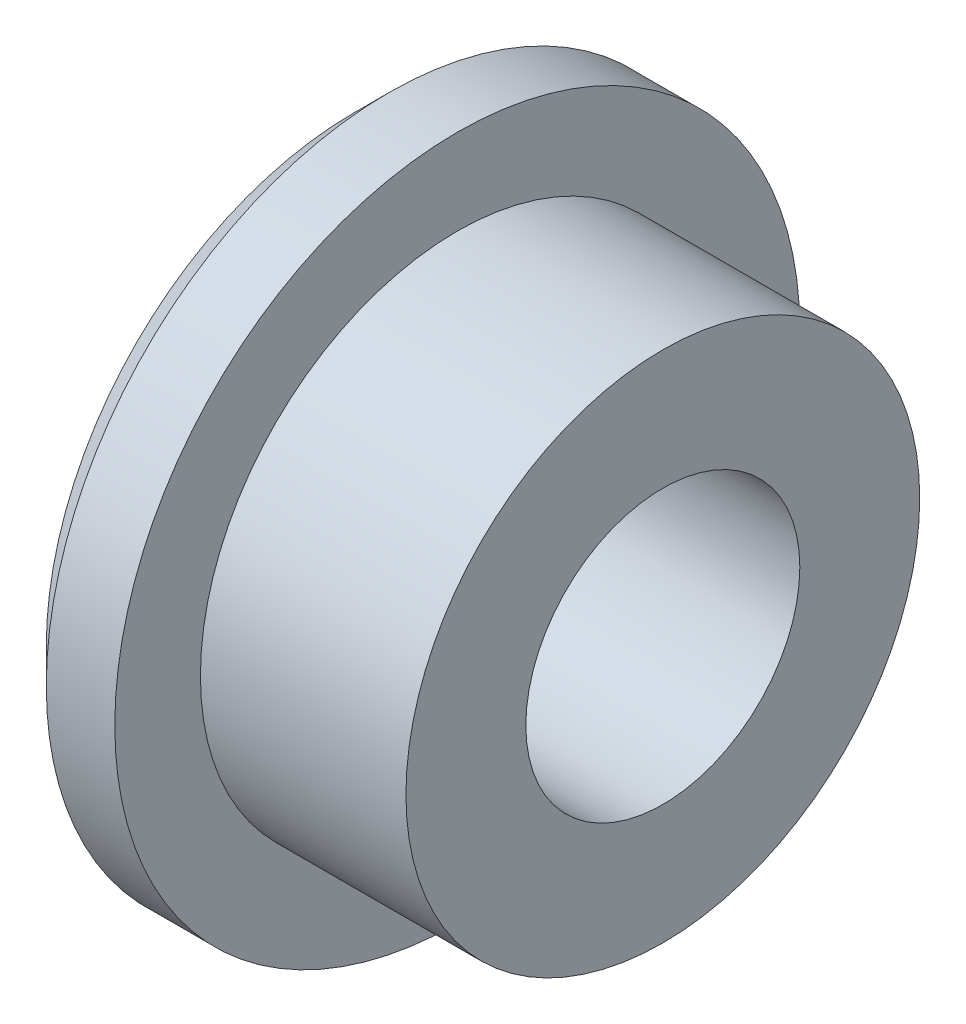
ISO-10303-21;
HEADER;
FILE_DESCRIPTION(('STEP AP214'),'2;1');
FILE_NAME('part.step','',(''),(''),'','','');
FILE_SCHEMA(('AUTOMOTIVE_DESIGN { 1 0 10303 214 1 1 1 1 }'));
ENDSEC;
DATA;
#1=APPLICATION_CONTEXT('core data for automotive mechanical design processes');
#2=APPLICATION_PROTOCOL_DEFINITION('international standard','automotive_design',2000,#1);
#3=PRODUCT_CONTEXT('',#1,'mechanical');
#4=PRODUCT('Part','Part','',(#3));
#5=PRODUCT_RELATED_PRODUCT_CATEGORY('part','',(#4));
#6=PRODUCT_DEFINITION_FORMATION('','',#4);
#7=PRODUCT_DEFINITION_CONTEXT('part definition',#1,'design');
#8=PRODUCT_DEFINITION('design','',#6,#7);
#9=PRODUCT_DEFINITION_SHAPE('','',#8);
#10=(LENGTH_UNIT() NAMED_UNIT(*) SI_UNIT(.MILLI.,.METRE.));
#11=(NAMED_UNIT(*) PLANE_ANGLE_UNIT() SI_UNIT($,.RADIAN.));
#12=(NAMED_UNIT(*) SI_UNIT($,.STERADIAN.) SOLID_ANGLE_UNIT());
#13=UNCERTAINTY_MEASURE_WITH_UNIT(LENGTH_MEASURE(1.E-05),#10,'distance_accuracy_value','');
#14=(GEOMETRIC_REPRESENTATION_CONTEXT(3) GLOBAL_UNCERTAINTY_ASSIGNED_CONTEXT((#13)) GLOBAL_UNIT_ASSIGNED_CONTEXT((#10,
#11,#12)) REPRESENTATION_CONTEXT('',''));
#15=CARTESIAN_POINT('',(0.,0.,0.));
#16=DIRECTION('',(0.,0.,1.));
#17=DIRECTION('',(1.,0.,0.));
#18=AXIS2_PLACEMENT_3D('',#15,#16,#17);
#19=CARTESIAN_POINT('',(-9.35,-95.41619429047,-4.));
#20=DIRECTION('',(-1.,0.,0.));
#21=DIRECTION('',(0.,0.,1.));
#22=AXIS2_PLACEMENT_3D('',#19,#20,#21);
#23=PLANE('',#22);
#24=CARTESIAN_POINT('',(-9.35,-95.41619429047,0.));
#25=DIRECTION('',(-1.,0.,0.));
#26=DIRECTION('',(0.,-1.,0.));
#27=AXIS2_PLACEMENT_3D('',#24,#25,#26);
#28=CIRCLE('',#27,4.);
#29=CARTESIAN_POINT('',(-9.35,-95.41619429047,-4.));
#30=VERTEX_POINT('',#29);
#31=CARTESIAN_POINT('',(-9.35,-95.41619429047,4.));
#32=VERTEX_POINT('',#31);
#33=EDGE_CURVE('E144',#30,#32,#28,.T.);
#34=ORIENTED_EDGE('',*,*,#33,.F.);
#35=CARTESIAN_POINT('',(-9.35,-95.41619429047,0.));
#36=DIRECTION('',(-1.,0.,0.));
#37=DIRECTION('',(0.,-1.,0.));
#38=AXIS2_PLACEMENT_3D('',#35,#36,#37);
#39=CIRCLE('',#38,4.);
#40=EDGE_CURVE('E150',#32,#30,#39,.T.);
#41=ORIENTED_EDGE('',*,*,#40,.F.);
#42=EDGE_LOOP('',(#34,#41));
#43=FACE_BOUND('',#42,.T.);
#44=CARTESIAN_POINT('',(-9.35,-95.41619429047,0.));
#45=DIRECTION('',(-1.,0.,0.));
#46=DIRECTION('',(0.,-1.,0.));
#47=AXIS2_PLACEMENT_3D('',#44,#45,#46);
#48=CIRCLE('',#47,9.);
#49=CARTESIAN_POINT('',(-9.35,-95.41619429047,-9.));
#50=VERTEX_POINT('',#49);
#51=CARTESIAN_POINT('',(-9.35,-95.41619429047,9.));
#52=VERTEX_POINT('',#51);
#53=EDGE_CURVE('E52',#50,#52,#48,.T.);
#54=ORIENTED_EDGE('',*,*,#53,.T.);
#55=CARTESIAN_POINT('',(-9.35,-95.41619429047,0.));
#56=DIRECTION('',(-1.,0.,0.));
#57=DIRECTION('',(0.,-1.,0.));
#58=AXIS2_PLACEMENT_3D('',#55,#56,#57);
#59=CIRCLE('',#58,9.);
#60=EDGE_CURVE('E11',#52,#50,#59,.T.);
#61=ORIENTED_EDGE('',*,*,#60,.T.);
#62=EDGE_LOOP('',(#54,#61));
#63=FACE_BOUND('',#62,.T.);
#64=ADVANCED_FACE('F48',(#43,#63),#23,.T.);
#65=CARTESIAN_POINT('',(-8.85,-95.41619429047,0.));
#66=DIRECTION('',(1.,0.,0.));
#67=DIRECTION('',(0.,0.,-1.));
#68=AXIS2_PLACEMENT_3D('',#65,#66,#67);
#69=CONICAL_SURFACE('',#68,9.5,0.785398163397448);
#70=CARTESIAN_POINT('',(-8.35,-95.41619429047,0.));
#71=DIRECTION('',(-1.,0.,0.));
#72=DIRECTION('',(0.,-1.,0.));
#73=AXIS2_PLACEMENT_3D('',#70,#71,#72);
#74=CIRCLE('',#73,10.);
#75=CARTESIAN_POINT('',(-8.35,-95.41619429047,-10.));
#76=VERTEX_POINT('',#75);
#77=CARTESIAN_POINT('',(-8.35,-95.41619429047,10.));
#78=VERTEX_POINT('',#77);
#79=EDGE_CURVE('E157',#76,#78,#74,.T.);
#80=ORIENTED_EDGE('',*,*,#79,.T.);
#81=DIRECTION('',(-0.707106781186548,0.,-0.707106781186547));
#82=VECTOR('',#81,1.);
#83=CARTESIAN_POINT('',(-8.85,-95.41619429047,9.5));
#84=LINE('',#83,#82);
#85=EDGE_CURVE('E166',#78,#52,#84,.T.);
#86=ORIENTED_EDGE('',*,*,#85,.T.);
#87=ORIENTED_EDGE('',*,*,#53,.F.);
#88=ORIENTED_EDGE('',*,*,#60,.F.);
#89=ORIENTED_EDGE('',*,*,#85,.F.);
#90=CARTESIAN_POINT('',(-8.35,-95.41619429047,0.));
#91=DIRECTION('',(-1.,0.,0.));
#92=DIRECTION('',(0.,-1.,0.));
#93=AXIS2_PLACEMENT_3D('',#90,#91,#92);
#94=CIRCLE('',#93,10.);
#95=EDGE_CURVE('E165',#78,#76,#94,.T.);
#96=ORIENTED_EDGE('',*,*,#95,.T.);
#97=EDGE_LOOP('',(#80,#86,#87,#88,#89,#96));
#98=FACE_BOUND('',#97,.T.);
#99=ADVANCED_FACE('F50',(#98),#69,.T.);
#100=CARTESIAN_POINT('',(-7.35,-95.41619429047,0.));
#101=DIRECTION('',(-1.,0.,0.));
#102=DIRECTION('',(0.,0.,-1.));
#103=AXIS2_PLACEMENT_3D('',#100,#101,#102);
#104=CYLINDRICAL_SURFACE('',#103,10.);
#105=ORIENTED_EDGE('',*,*,#79,.F.);
#106=ORIENTED_EDGE('',*,*,#95,.F.);
#107=DIRECTION('',(1.,0.,0.));
#108=VECTOR('',#107,1.);
#109=CARTESIAN_POINT('',(-7.35,-95.41619429047,10.));
#110=LINE('',#109,#108);
#111=CARTESIAN_POINT('',(-6.35,-95.41619429047,10.));
#112=VERTEX_POINT('',#111);
#113=EDGE_CURVE('E88',#78,#112,#110,.T.);
#114=ORIENTED_EDGE('',*,*,#113,.T.);
#115=CARTESIAN_POINT('',(-6.35,-95.41619429047,0.));
#116=DIRECTION('',(-1.,0.,0.));
#117=DIRECTION('',(0.,-1.,0.));
#118=AXIS2_PLACEMENT_3D('',#115,#116,#117);
#119=CIRCLE('',#118,10.);
#120=CARTESIAN_POINT('',(-6.35,-95.41619429047,-10.));
#121=VERTEX_POINT('',#120);
#122=EDGE_CURVE('E97',#112,#121,#119,.T.);
#123=ORIENTED_EDGE('',*,*,#122,.T.);
#124=CARTESIAN_POINT('',(-6.35,-95.41619429047,0.));
#125=DIRECTION('',(-1.,0.,0.));
#126=DIRECTION('',(0.,-1.,0.));
#127=AXIS2_PLACEMENT_3D('',#124,#125,#126);
#128=CIRCLE('',#127,10.);
#129=EDGE_CURVE('E135',#121,#112,#128,.T.);
#130=ORIENTED_EDGE('',*,*,#129,.T.);
#131=ORIENTED_EDGE('',*,*,#113,.F.);
#132=EDGE_LOOP('',(#105,#106,#114,#123,#130,#131));
#133=FACE_BOUND('',#132,.T.);
#134=ADVANCED_FACE('F196',(#133),#104,.T.);
#135=CARTESIAN_POINT('',(-6.35,-95.41619429047,-10.));
#136=DIRECTION('',(1.,0.,0.));
#137=DIRECTION('',(0.,1.,0.));
#138=AXIS2_PLACEMENT_3D('',#135,#136,#137);
#139=PLANE('',#138);
#140=CARTESIAN_POINT('',(-6.35,-95.41619429047,0.));
#141=DIRECTION('',(-1.,0.,0.));
#142=DIRECTION('',(0.,-1.,0.));
#143=AXIS2_PLACEMENT_3D('',#140,#141,#142);
#144=CIRCLE('',#143,7.5);
#145=CARTESIAN_POINT('',(-6.35,-95.41619429047,-7.5));
#146=VERTEX_POINT('',#145);
#147=CARTESIAN_POINT('',(-6.35,-95.41619429047,7.5));
#148=VERTEX_POINT('',#147);
#149=EDGE_CURVE('E141',#146,#148,#144,.T.);
#150=ORIENTED_EDGE('',*,*,#149,.T.);
#151=CARTESIAN_POINT('',(-6.35,-95.41619429047,0.));
#152=DIRECTION('',(-1.,0.,0.));
#153=DIRECTION('',(0.,-1.,0.));
#154=AXIS2_PLACEMENT_3D('',#151,#152,#153);
#155=CIRCLE('',#154,7.5);
#156=EDGE_CURVE('E132',#148,#146,#155,.T.);
#157=ORIENTED_EDGE('',*,*,#156,.T.);
#158=EDGE_LOOP('',(#150,#157));
#159=FACE_BOUND('',#158,.T.);
#160=ORIENTED_EDGE('',*,*,#129,.F.);
#161=ORIENTED_EDGE('',*,*,#122,.F.);
#162=EDGE_LOOP('',(#160,#161));
#163=FACE_BOUND('',#162,.T.);
#164=ADVANCED_FACE('F193',(#159,#163),#139,.T.);
#165=CARTESIAN_POINT('',(-3.35,-95.41619429047,0.));
#166=DIRECTION('',(-1.,0.,0.));
#167=DIRECTION('',(0.,0.,-1.));
#168=AXIS2_PLACEMENT_3D('',#165,#166,#167);
#169=CYLINDRICAL_SURFACE('',#168,7.5);
#170=ORIENTED_EDGE('',*,*,#149,.F.);
#171=ORIENTED_EDGE('',*,*,#156,.F.);
#172=DIRECTION('',(1.,0.,0.));
#173=VECTOR('',#172,1.);
#174=CARTESIAN_POINT('',(-3.35,-95.41619429047,7.5));
#175=LINE('',#174,#173);
#176=CARTESIAN_POINT('',(-0.35,-95.41619429047,7.5));
#177=VERTEX_POINT('',#176);
#178=EDGE_CURVE('E110',#148,#177,#175,.T.);
#179=ORIENTED_EDGE('',*,*,#178,.T.);
#180=CARTESIAN_POINT('',(-0.35,-95.41619429047,0.));
#181=DIRECTION('',(-1.,0.,0.));
#182=DIRECTION('',(0.,-1.,0.));
#183=AXIS2_PLACEMENT_3D('',#180,#181,#182);
#184=CIRCLE('',#183,7.5);
#185=CARTESIAN_POINT('',(-0.35,-95.41619429047,-7.5));
#186=VERTEX_POINT('',#185);
#187=EDGE_CURVE('E130',#177,#186,#184,.T.);
#188=ORIENTED_EDGE('',*,*,#187,.T.);
#189=CARTESIAN_POINT('',(-0.35,-95.41619429047,0.));
#190=DIRECTION('',(-1.,0.,0.));
#191=DIRECTION('',(0.,-1.,0.));
#192=AXIS2_PLACEMENT_3D('',#189,#190,#191);
#193=CIRCLE('',#192,7.5);
#194=EDGE_CURVE('E139',#186,#177,#193,.T.);
#195=ORIENTED_EDGE('',*,*,#194,.T.);
#196=ORIENTED_EDGE('',*,*,#178,.F.);
#197=EDGE_LOOP('',(#170,#171,#179,#188,#195,#196));
#198=FACE_BOUND('',#197,.T.);
#199=ADVANCED_FACE('F129',(#198),#169,.T.);
#200=CARTESIAN_POINT('',(-0.35,-95.41619429047,-7.5));
#201=DIRECTION('',(1.,0.,0.));
#202=DIRECTION('',(0.,1.,0.));
#203=AXIS2_PLACEMENT_3D('',#200,#201,#202);
#204=PLANE('',#203);
#205=CARTESIAN_POINT('',(-0.35,-95.41619429047,0.));
#206=DIRECTION('',(-1.,0.,0.));
#207=DIRECTION('',(0.,-1.,0.));
#208=AXIS2_PLACEMENT_3D('',#205,#206,#207);
#209=CIRCLE('',#208,4.);
#210=CARTESIAN_POINT('',(-0.35,-95.41619429047,-4.));
#211=VERTEX_POINT('',#210);
#212=CARTESIAN_POINT('',(-0.35,-95.41619429047,4.));
#213=VERTEX_POINT('',#212);
#214=EDGE_CURVE('E184',#211,#213,#209,.T.);
#215=ORIENTED_EDGE('',*,*,#214,.T.);
#216=CARTESIAN_POINT('',(-0.35,-95.41619429047,0.));
#217=DIRECTION('',(-1.,0.,0.));
#218=DIRECTION('',(0.,-1.,0.));
#219=AXIS2_PLACEMENT_3D('',#216,#217,#218);
#220=CIRCLE('',#219,4.);
#221=EDGE_CURVE('E181',#213,#211,#220,.T.);
#222=ORIENTED_EDGE('',*,*,#221,.T.);
#223=EDGE_LOOP('',(#215,#222));
#224=FACE_BOUND('',#223,.T.);
#225=ORIENTED_EDGE('',*,*,#194,.F.);
#226=ORIENTED_EDGE('',*,*,#187,.F.);
#227=EDGE_LOOP('',(#225,#226));
#228=FACE_BOUND('',#227,.T.);
#229=ADVANCED_FACE('F138',(#224,#228),#204,.T.);
#230=CARTESIAN_POINT('',(-4.85,-95.41619429047,0.));
#231=DIRECTION('',(-1.,0.,0.));
#232=DIRECTION('',(0.,0.,-1.));
#233=AXIS2_PLACEMENT_3D('',#230,#231,#232);
#234=CYLINDRICAL_SURFACE('',#233,4.);
#235=ORIENTED_EDGE('',*,*,#214,.F.);
#236=ORIENTED_EDGE('',*,*,#221,.F.);
#237=DIRECTION('',(-1.,0.,0.));
#238=VECTOR('',#237,1.);
#239=CARTESIAN_POINT('',(-4.85,-95.41619429047,4.));
#240=LINE('',#239,#238);
#241=EDGE_CURVE('E177',#213,#32,#240,.T.);
#242=ORIENTED_EDGE('',*,*,#241,.T.);
#243=ORIENTED_EDGE('',*,*,#40,.T.);
#244=ORIENTED_EDGE('',*,*,#33,.T.);
#245=ORIENTED_EDGE('',*,*,#241,.F.);
#246=EDGE_LOOP('',(#235,#236,#242,#243,#244,#245));
#247=FACE_BOUND('',#246,.T.);
#248=ADVANCED_FACE('F251',(#247),#234,.F.);
#249=CLOSED_SHELL('',(#64,#99,#134,#164,#199,#229,#248));
#250=MANIFOLD_SOLID_BREP('B2',#249);
#251=ADVANCED_BREP_SHAPE_REPRESENTATION('',(#18,#250),#14);
#252=SHAPE_DEFINITION_REPRESENTATION(#9,#251);
ENDSEC;
END-ISO-10303-21;
